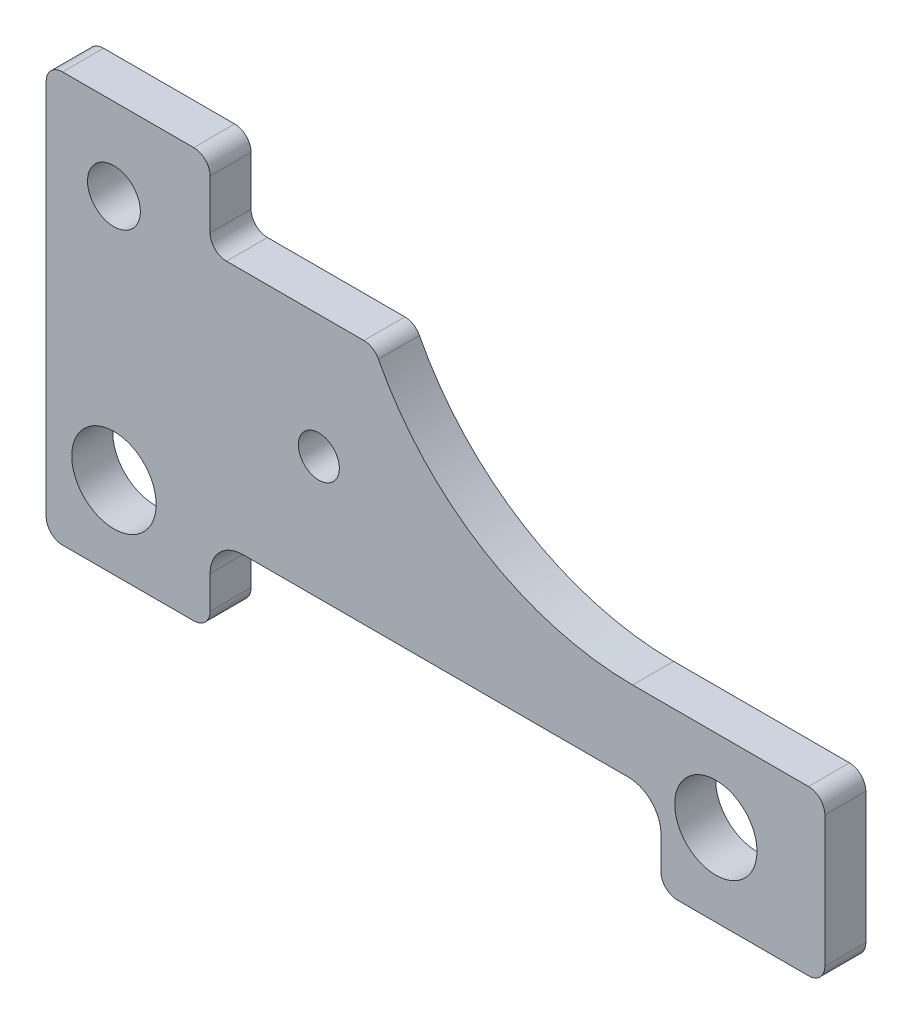
ISO-10303-21;
HEADER;
FILE_DESCRIPTION(('STEP AP214'),'2;1');
FILE_NAME('part.step','',(''),(''),'','','');
FILE_SCHEMA(('AUTOMOTIVE_DESIGN { 1 0 10303 214 1 1 1 1 }'));
ENDSEC;
DATA;
#1=APPLICATION_CONTEXT('core data for automotive mechanical design processes');
#2=APPLICATION_PROTOCOL_DEFINITION('international standard','automotive_design',2000,#1);
#3=PRODUCT_CONTEXT('',#1,'mechanical');
#4=PRODUCT('Part','Part','',(#3));
#5=PRODUCT_RELATED_PRODUCT_CATEGORY('part','',(#4));
#6=PRODUCT_DEFINITION_FORMATION('','',#4);
#7=PRODUCT_DEFINITION_CONTEXT('part definition',#1,'design');
#8=PRODUCT_DEFINITION('design','',#6,#7);
#9=PRODUCT_DEFINITION_SHAPE('','',#8);
#10=(LENGTH_UNIT() NAMED_UNIT(*) SI_UNIT(.MILLI.,.METRE.));
#11=(NAMED_UNIT(*) PLANE_ANGLE_UNIT() SI_UNIT($,.RADIAN.));
#12=(NAMED_UNIT(*) SI_UNIT($,.STERADIAN.) SOLID_ANGLE_UNIT());
#13=UNCERTAINTY_MEASURE_WITH_UNIT(LENGTH_MEASURE(1.E-05),#10,'distance_accuracy_value','');
#14=(GEOMETRIC_REPRESENTATION_CONTEXT(3) GLOBAL_UNCERTAINTY_ASSIGNED_CONTEXT((#13)) GLOBAL_UNIT_ASSIGNED_CONTEXT((#10,
#11,#12)) REPRESENTATION_CONTEXT('',''));
#15=CARTESIAN_POINT('',(0.,0.,0.));
#16=DIRECTION('',(0.,0.,1.));
#17=DIRECTION('',(1.,0.,0.));
#18=AXIS2_PLACEMENT_3D('',#15,#16,#17);
#19=CARTESIAN_POINT('',(35.2424242424242,-19.,5.));
#20=DIRECTION('',(0.,0.,-1.));
#21=DIRECTION('',(-1.,0.,0.));
#22=AXIS2_PLACEMENT_3D('',#19,#20,#21);
#23=PLANE('',#22);
#24=DIRECTION('',(1.,0.,0.));
#25=VECTOR('',#24,1.);
#26=CARTESIAN_POINT('',(-11.7575757575757,-15.,5.));
#27=LINE('',#26,#25);
#28=CARTESIAN_POINT('',(-11.7575757575757,-15.,5.));
#29=VERTEX_POINT('',#28);
#30=CARTESIAN_POINT('',(35.2424242424242,-15.,5.));
#31=VERTEX_POINT('',#30);
#32=EDGE_CURVE('E141',#29,#31,#27,.T.);
#33=ORIENTED_EDGE('',*,*,#32,.T.);
#34=CARTESIAN_POINT('',(35.2424242424242,-19.,5.));
#35=DIRECTION('',(0.,0.,-1.));
#36=DIRECTION('',(-1.,0.,0.));
#37=AXIS2_PLACEMENT_3D('',#34,#35,#36);
#38=CIRCLE('',#37,4.);
#39=CARTESIAN_POINT('',(39.2424242424242,-19.,5.));
#40=VERTEX_POINT('',#39);
#41=EDGE_CURVE('E392',#31,#40,#38,.T.);
#42=ORIENTED_EDGE('',*,*,#41,.T.);
#43=DIRECTION('',(0.,-1.,0.));
#44=VECTOR('',#43,1.);
#45=CARTESIAN_POINT('',(39.2424242424242,-19.,5.));
#46=LINE('',#45,#44);
#47=CARTESIAN_POINT('',(39.2424242424242,-23.,5.));
#48=VERTEX_POINT('',#47);
#49=EDGE_CURVE('E329',#40,#48,#46,.T.);
#50=ORIENTED_EDGE('',*,*,#49,.T.);
#51=CARTESIAN_POINT('',(41.2424242424242,-23.,5.));
#52=DIRECTION('',(0.,0.,1.));
#53=DIRECTION('',(-1.,0.,0.));
#54=AXIS2_PLACEMENT_3D('',#51,#52,#53);
#55=CIRCLE('',#54,2.);
#56=CARTESIAN_POINT('',(41.2424242424242,-25.,5.));
#57=VERTEX_POINT('',#56);
#58=EDGE_CURVE('E348',#48,#57,#55,.T.);
#59=ORIENTED_EDGE('',*,*,#58,.T.);
#60=DIRECTION('',(1.,0.,0.));
#61=VECTOR('',#60,1.);
#62=CARTESIAN_POINT('',(41.2424242424242,-25.,5.));
#63=LINE('',#62,#61);
#64=CARTESIAN_POINT('',(57.2424242424242,-25.,5.));
#65=VERTEX_POINT('',#64);
#66=EDGE_CURVE('E345',#57,#65,#63,.T.);
#67=ORIENTED_EDGE('',*,*,#66,.T.);
#68=CARTESIAN_POINT('',(57.2424242424242,-23.,5.));
#69=DIRECTION('',(0.,0.,1.));
#70=DIRECTION('',(1.,0.,0.));
#71=AXIS2_PLACEMENT_3D('',#68,#69,#70);
#72=CIRCLE('',#71,2.);
#73=CARTESIAN_POINT('',(59.2424242424242,-23.,5.));
#74=VERTEX_POINT('',#73);
#75=EDGE_CURVE('E347',#65,#74,#72,.T.);
#76=ORIENTED_EDGE('',*,*,#75,.T.);
#77=DIRECTION('',(0.,1.,0.));
#78=VECTOR('',#77,1.);
#79=CARTESIAN_POINT('',(59.2424242424242,-23.,5.));
#80=LINE('',#79,#78);
#81=CARTESIAN_POINT('',(59.2424242424242,-7.00000000000002,5.));
#82=VERTEX_POINT('',#81);
#83=EDGE_CURVE('E350',#74,#82,#80,.T.);
#84=ORIENTED_EDGE('',*,*,#83,.T.);
#85=CARTESIAN_POINT('',(57.2424242424242,-7.,5.));
#86=DIRECTION('',(0.,0.,1.));
#87=DIRECTION('',(-1.,0.,0.));
#88=AXIS2_PLACEMENT_3D('',#85,#86,#87);
#89=CIRCLE('',#88,2.);
#90=CARTESIAN_POINT('',(57.2424242424242,-5.,5.));
#91=VERTEX_POINT('',#90);
#92=EDGE_CURVE('E356',#82,#91,#89,.T.);
#93=ORIENTED_EDGE('',*,*,#92,.T.);
#94=DIRECTION('',(-1.,0.,0.));
#95=VECTOR('',#94,1.);
#96=CARTESIAN_POINT('',(57.2424242424242,-5.,5.));
#97=LINE('',#96,#95);
#98=CARTESIAN_POINT('',(35.792732381733,-5.,5.));
#99=VERTEX_POINT('',#98);
#100=EDGE_CURVE('E358',#91,#99,#97,.T.);
#101=ORIENTED_EDGE('',*,*,#100,.T.);
#102=CARTESIAN_POINT('',(35.8652364660258,29.9999249021732,5.));
#103=DIRECTION('',(0.,0.,-1.));
#104=DIRECTION('',(1.,0.,0.));
#105=AXIS2_PLACEMENT_3D('',#102,#103,#104);
#106=CIRCLE('',#105,35.);
#107=CARTESIAN_POINT('',(4.77824375187092,13.9189148595769,5.));
#108=VERTEX_POINT('',#107);
#109=EDGE_CURVE('E360',#99,#108,#106,.T.);
#110=ORIENTED_EDGE('',*,*,#109,.T.);
#111=CARTESIAN_POINT('',(3.00184416820493,13.,5.));
#112=DIRECTION('',(0.,0.,1.));
#113=DIRECTION('',(1.,0.,0.));
#114=AXIS2_PLACEMENT_3D('',#111,#112,#113);
#115=CIRCLE('',#114,2.);
#116=CARTESIAN_POINT('',(3.00184416820493,15.,5.));
#117=VERTEX_POINT('',#116);
#118=EDGE_CURVE('E362',#108,#117,#115,.T.);
#119=ORIENTED_EDGE('',*,*,#118,.T.);
#120=DIRECTION('',(-1.,0.,0.));
#121=VECTOR('',#120,1.);
#122=CARTESIAN_POINT('',(-13.7575757575757,15.,5.));
#123=LINE('',#122,#121);
#124=CARTESIAN_POINT('',(-13.7575757575757,15.,5.));
#125=VERTEX_POINT('',#124);
#126=EDGE_CURVE('E364',#117,#125,#123,.T.);
#127=ORIENTED_EDGE('',*,*,#126,.T.);
#128=CARTESIAN_POINT('',(-13.7575757575758,17.,5.));
#129=DIRECTION('',(0.,0.,-1.));
#130=DIRECTION('',(1.,0.,0.));
#131=AXIS2_PLACEMENT_3D('',#128,#129,#130);
#132=CIRCLE('',#131,2.);
#133=CARTESIAN_POINT('',(-15.7575757575758,17.,5.));
#134=VERTEX_POINT('',#133);
#135=EDGE_CURVE('E366',#125,#134,#132,.T.);
#136=ORIENTED_EDGE('',*,*,#135,.T.);
#137=DIRECTION('',(0.,1.,0.));
#138=VECTOR('',#137,1.);
#139=CARTESIAN_POINT('',(-15.7575757575758,23.,5.));
#140=LINE('',#139,#138);
#141=CARTESIAN_POINT('',(-15.7575757575758,23.,5.));
#142=VERTEX_POINT('',#141);
#143=EDGE_CURVE('E368',#134,#142,#140,.T.);
#144=ORIENTED_EDGE('',*,*,#143,.T.);
#145=CARTESIAN_POINT('',(-17.7575757575758,23.,5.));
#146=DIRECTION('',(0.,0.,1.));
#147=DIRECTION('',(-1.,0.,0.));
#148=AXIS2_PLACEMENT_3D('',#145,#146,#147);
#149=CIRCLE('',#148,2.);
#150=CARTESIAN_POINT('',(-17.7575757575758,25.,5.));
#151=VERTEX_POINT('',#150);
#152=EDGE_CURVE('E370',#142,#151,#149,.T.);
#153=ORIENTED_EDGE('',*,*,#152,.T.);
#154=DIRECTION('',(-1.,0.,0.));
#155=VECTOR('',#154,1.);
#156=CARTESIAN_POINT('',(-33.7575757575758,25.,5.));
#157=LINE('',#156,#155);
#158=CARTESIAN_POINT('',(-33.7575757575758,25.,5.));
#159=VERTEX_POINT('',#158);
#160=EDGE_CURVE('E372',#151,#159,#157,.T.);
#161=ORIENTED_EDGE('',*,*,#160,.T.);
#162=CARTESIAN_POINT('',(-33.7575757575758,23.,5.));
#163=DIRECTION('',(0.,0.,1.));
#164=DIRECTION('',(-1.,0.,0.));
#165=AXIS2_PLACEMENT_3D('',#162,#163,#164);
#166=CIRCLE('',#165,2.);
#167=CARTESIAN_POINT('',(-35.7575757575758,23.,5.));
#168=VERTEX_POINT('',#167);
#169=EDGE_CURVE('E374',#159,#168,#166,.T.);
#170=ORIENTED_EDGE('',*,*,#169,.T.);
#171=DIRECTION('',(0.,-1.,0.));
#172=VECTOR('',#171,1.);
#173=CARTESIAN_POINT('',(-35.7575757575758,23.,5.));
#174=LINE('',#173,#172);
#175=CARTESIAN_POINT('',(-35.7575757575758,-23.,5.));
#176=VERTEX_POINT('',#175);
#177=EDGE_CURVE('E376',#168,#176,#174,.T.);
#178=ORIENTED_EDGE('',*,*,#177,.T.);
#179=CARTESIAN_POINT('',(-33.7575757575758,-23.,5.));
#180=DIRECTION('',(0.,0.,1.));
#181=DIRECTION('',(-1.,0.,0.));
#182=AXIS2_PLACEMENT_3D('',#179,#180,#181);
#183=CIRCLE('',#182,2.);
#184=CARTESIAN_POINT('',(-33.7575757575757,-25.,5.));
#185=VERTEX_POINT('',#184);
#186=EDGE_CURVE('E378',#176,#185,#183,.T.);
#187=ORIENTED_EDGE('',*,*,#186,.T.);
#188=DIRECTION('',(1.,0.,0.));
#189=VECTOR('',#188,1.);
#190=CARTESIAN_POINT('',(-33.7575757575757,-25.,5.));
#191=LINE('',#190,#189);
#192=CARTESIAN_POINT('',(-17.7575757575758,-25.,5.));
#193=VERTEX_POINT('',#192);
#194=EDGE_CURVE('E206',#185,#193,#191,.T.);
#195=ORIENTED_EDGE('',*,*,#194,.T.);
#196=CARTESIAN_POINT('',(-17.7575757575758,-23.,5.));
#197=DIRECTION('',(0.,0.,1.));
#198=DIRECTION('',(1.,0.,0.));
#199=AXIS2_PLACEMENT_3D('',#196,#197,#198);
#200=CIRCLE('',#199,2.);
#201=CARTESIAN_POINT('',(-15.7575757575758,-23.,5.));
#202=VERTEX_POINT('',#201);
#203=EDGE_CURVE('E200',#193,#202,#200,.T.);
#204=ORIENTED_EDGE('',*,*,#203,.T.);
#205=DIRECTION('',(0.,1.,0.));
#206=VECTOR('',#205,1.);
#207=CARTESIAN_POINT('',(-15.7575757575758,-19.,5.));
#208=LINE('',#207,#206);
#209=CARTESIAN_POINT('',(-15.7575757575758,-19.,5.));
#210=VERTEX_POINT('',#209);
#211=EDGE_CURVE('E204',#202,#210,#208,.T.);
#212=ORIENTED_EDGE('',*,*,#211,.T.);
#213=CARTESIAN_POINT('',(-11.7575757575758,-19.,5.));
#214=DIRECTION('',(0.,0.,-1.));
#215=DIRECTION('',(-1.,0.,0.));
#216=AXIS2_PLACEMENT_3D('',#213,#214,#215);
#217=CIRCLE('',#216,4.);
#218=EDGE_CURVE('E54',#210,#29,#217,.T.);
#219=ORIENTED_EDGE('',*,*,#218,.T.);
#220=EDGE_LOOP('',(#33,#42,#50,#59,#67,#76,#84,#93,#101,#110,#119,#127,#136,#144,#153,#161,#170,
#178,#187,#195,#204,#212,#219));
#221=FACE_BOUND('',#220,.T.);
#222=CARTESIAN_POINT('',(45.9440771313276,-15.,5.));
#223=DIRECTION('',(0.,0.,1.));
#224=DIRECTION('',(1.,0.,0.));
#225=AXIS2_PLACEMENT_3D('',#222,#223,#224);
#226=CIRCLE('',#225,5.01807771651485);
#227=CARTESIAN_POINT('',(50.9621548478424,-15.,5.));
#228=VERTEX_POINT('',#227);
#229=EDGE_CURVE('E226',#228,#228,#226,.T.);
#230=ORIENTED_EDGE('',*,*,#229,.F.);
#231=EDGE_LOOP('',(#230));
#232=FACE_BOUND('',#231,.T.);
#233=CARTESIAN_POINT('',(-27.4902663030158,-15.,5.));
#234=DIRECTION('',(0.,0.,1.));
#235=DIRECTION('',(1.,0.,0.));
#236=AXIS2_PLACEMENT_3D('',#233,#234,#235);
#237=CIRCLE('',#236,5.15);
#238=CARTESIAN_POINT('',(-22.3402663030158,-15.,5.));
#239=VERTEX_POINT('',#238);
#240=EDGE_CURVE('E743',#239,#239,#237,.T.);
#241=ORIENTED_EDGE('',*,*,#240,.F.);
#242=EDGE_LOOP('',(#241));
#243=FACE_BOUND('',#242,.T.);
#244=CARTESIAN_POINT('',(-27.4902663030159,15.,5.));
#245=DIRECTION('',(0.,0.,1.));
#246=DIRECTION('',(1.,0.,0.));
#247=AXIS2_PLACEMENT_3D('',#244,#245,#246);
#248=CIRCLE('',#247,3.225);
#249=CARTESIAN_POINT('',(-24.2652663030159,15.,5.));
#250=VERTEX_POINT('',#249);
#251=EDGE_CURVE('E737',#250,#250,#248,.T.);
#252=ORIENTED_EDGE('',*,*,#251,.F.);
#253=EDGE_LOOP('',(#252));
#254=FACE_BOUND('',#253,.T.);
#255=CARTESIAN_POINT('',(-2.49026630301585,0.,5.));
#256=DIRECTION('',(0.,0.,1.));
#257=DIRECTION('',(1.,0.,0.));
#258=AXIS2_PLACEMENT_3D('',#255,#256,#257);
#259=CIRCLE('',#258,2.5);
#260=CARTESIAN_POINT('',(0.00973369698414666,0.,5.));
#261=VERTEX_POINT('',#260);
#262=EDGE_CURVE('E728',#261,#261,#259,.T.);
#263=ORIENTED_EDGE('',*,*,#262,.F.);
#264=EDGE_LOOP('',(#263));
#265=FACE_BOUND('',#264,.T.);
#266=ADVANCED_FACE('F37',(#221,#232,#243,#254,#265),#23,.F.);
#267=CARTESIAN_POINT('',(35.2424242424242,-19.,0.));
#268=DIRECTION('',(0.,0.,-1.));
#269=DIRECTION('',(-1.,0.,0.));
#270=AXIS2_PLACEMENT_3D('',#267,#268,#269);
#271=PLANE('',#270);
#272=CARTESIAN_POINT('',(-27.4902663030159,15.,0.));
#273=DIRECTION('',(0.,0.,1.));
#274=DIRECTION('',(1.,0.,0.));
#275=AXIS2_PLACEMENT_3D('',#272,#273,#274);
#276=CIRCLE('',#275,3.225);
#277=CARTESIAN_POINT('',(-24.2652663030159,15.,0.));
#278=VERTEX_POINT('',#277);
#279=EDGE_CURVE('E734',#278,#278,#276,.T.);
#280=ORIENTED_EDGE('',*,*,#279,.T.);
#281=EDGE_LOOP('',(#280));
#282=FACE_BOUND('',#281,.T.);
#283=CARTESIAN_POINT('',(45.9440771313276,-15.,0.));
#284=DIRECTION('',(0.,0.,1.));
#285=DIRECTION('',(1.,0.,0.));
#286=AXIS2_PLACEMENT_3D('',#283,#284,#285);
#287=CIRCLE('',#286,5.01807771651485);
#288=CARTESIAN_POINT('',(50.9621548478424,-15.,0.));
#289=VERTEX_POINT('',#288);
#290=EDGE_CURVE('E396',#289,#289,#287,.T.);
#291=ORIENTED_EDGE('',*,*,#290,.T.);
#292=EDGE_LOOP('',(#291));
#293=FACE_BOUND('',#292,.T.);
#294=DIRECTION('',(1.,0.,0.));
#295=VECTOR('',#294,1.);
#296=CARTESIAN_POINT('',(4.24242424242424,-15.,0.));
#297=LINE('',#296,#295);
#298=CARTESIAN_POINT('',(-11.7575757575757,-15.,0.));
#299=VERTEX_POINT('',#298);
#300=CARTESIAN_POINT('',(35.2424242424242,-15.,0.));
#301=VERTEX_POINT('',#300);
#302=EDGE_CURVE('E135',#299,#301,#297,.T.);
#303=ORIENTED_EDGE('',*,*,#302,.F.);
#304=CARTESIAN_POINT('',(-11.7575757575758,-19.,0.));
#305=DIRECTION('',(0.,0.,-1.));
#306=DIRECTION('',(-1.,0.,0.));
#307=AXIS2_PLACEMENT_3D('',#304,#305,#306);
#308=CIRCLE('',#307,4.);
#309=CARTESIAN_POINT('',(-15.7575757575758,-19.,0.));
#310=VERTEX_POINT('',#309);
#311=EDGE_CURVE('E266',#310,#299,#308,.T.);
#312=ORIENTED_EDGE('',*,*,#311,.F.);
#313=DIRECTION('',(0.,1.,0.));
#314=VECTOR('',#313,1.);
#315=CARTESIAN_POINT('',(-15.7575757575758,-19.,0.));
#316=LINE('',#315,#314);
#317=CARTESIAN_POINT('',(-15.7575757575758,-23.,0.));
#318=VERTEX_POINT('',#317);
#319=EDGE_CURVE('E128',#318,#310,#316,.T.);
#320=ORIENTED_EDGE('',*,*,#319,.F.);
#321=CARTESIAN_POINT('',(-17.7575757575758,-23.,0.));
#322=DIRECTION('',(0.,0.,1.));
#323=DIRECTION('',(1.,0.,0.));
#324=AXIS2_PLACEMENT_3D('',#321,#322,#323);
#325=CIRCLE('',#324,2.);
#326=CARTESIAN_POINT('',(-17.7575757575758,-25.,0.));
#327=VERTEX_POINT('',#326);
#328=EDGE_CURVE('E214',#327,#318,#325,.T.);
#329=ORIENTED_EDGE('',*,*,#328,.F.);
#330=DIRECTION('',(1.,0.,0.));
#331=VECTOR('',#330,1.);
#332=CARTESIAN_POINT('',(-33.7575757575757,-25.,0.));
#333=LINE('',#332,#331);
#334=CARTESIAN_POINT('',(-33.7575757575757,-25.,0.));
#335=VERTEX_POINT('',#334);
#336=EDGE_CURVE('E262',#335,#327,#333,.T.);
#337=ORIENTED_EDGE('',*,*,#336,.F.);
#338=CARTESIAN_POINT('',(-33.7575757575758,-23.,0.));
#339=DIRECTION('',(0.,0.,1.));
#340=DIRECTION('',(-1.,0.,0.));
#341=AXIS2_PLACEMENT_3D('',#338,#339,#340);
#342=CIRCLE('',#341,2.);
#343=CARTESIAN_POINT('',(-35.7575757575758,-23.,0.));
#344=VERTEX_POINT('',#343);
#345=EDGE_CURVE('E260',#344,#335,#342,.T.);
#346=ORIENTED_EDGE('',*,*,#345,.F.);
#347=DIRECTION('',(0.,-1.,0.));
#348=VECTOR('',#347,1.);
#349=CARTESIAN_POINT('',(-35.7575757575758,23.,0.));
#350=LINE('',#349,#348);
#351=CARTESIAN_POINT('',(-35.7575757575758,23.,0.));
#352=VERTEX_POINT('',#351);
#353=EDGE_CURVE('E258',#352,#344,#350,.T.);
#354=ORIENTED_EDGE('',*,*,#353,.F.);
#355=CARTESIAN_POINT('',(-33.7575757575758,23.,0.));
#356=DIRECTION('',(0.,0.,1.));
#357=DIRECTION('',(-1.,0.,0.));
#358=AXIS2_PLACEMENT_3D('',#355,#356,#357);
#359=CIRCLE('',#358,2.);
#360=CARTESIAN_POINT('',(-33.7575757575758,25.,0.));
#361=VERTEX_POINT('',#360);
#362=EDGE_CURVE('E256',#361,#352,#359,.T.);
#363=ORIENTED_EDGE('',*,*,#362,.F.);
#364=DIRECTION('',(-1.,0.,0.));
#365=VECTOR('',#364,1.);
#366=CARTESIAN_POINT('',(-33.7575757575758,25.,0.));
#367=LINE('',#366,#365);
#368=CARTESIAN_POINT('',(-17.7575757575758,25.,0.));
#369=VERTEX_POINT('',#368);
#370=EDGE_CURVE('E254',#369,#361,#367,.T.);
#371=ORIENTED_EDGE('',*,*,#370,.F.);
#372=CARTESIAN_POINT('',(-17.7575757575758,23.,0.));
#373=DIRECTION('',(0.,0.,1.));
#374=DIRECTION('',(-1.,0.,0.));
#375=AXIS2_PLACEMENT_3D('',#372,#373,#374);
#376=CIRCLE('',#375,2.);
#377=CARTESIAN_POINT('',(-15.7575757575758,23.,0.));
#378=VERTEX_POINT('',#377);
#379=EDGE_CURVE('E252',#378,#369,#376,.T.);
#380=ORIENTED_EDGE('',*,*,#379,.F.);
#381=DIRECTION('',(0.,1.,0.));
#382=VECTOR('',#381,1.);
#383=CARTESIAN_POINT('',(-15.7575757575758,23.,0.));
#384=LINE('',#383,#382);
#385=CARTESIAN_POINT('',(-15.7575757575758,17.,0.));
#386=VERTEX_POINT('',#385);
#387=EDGE_CURVE('E250',#386,#378,#384,.T.);
#388=ORIENTED_EDGE('',*,*,#387,.F.);
#389=CARTESIAN_POINT('',(-13.7575757575758,17.,0.));
#390=DIRECTION('',(0.,0.,-1.));
#391=DIRECTION('',(1.,0.,0.));
#392=AXIS2_PLACEMENT_3D('',#389,#390,#391);
#393=CIRCLE('',#392,2.);
#394=CARTESIAN_POINT('',(-13.7575757575757,15.,0.));
#395=VERTEX_POINT('',#394);
#396=EDGE_CURVE('E248',#395,#386,#393,.T.);
#397=ORIENTED_EDGE('',*,*,#396,.F.);
#398=DIRECTION('',(-1.,0.,0.));
#399=VECTOR('',#398,1.);
#400=CARTESIAN_POINT('',(-13.7575757575757,15.,0.));
#401=LINE('',#400,#399);
#402=CARTESIAN_POINT('',(3.00184416820493,15.,0.));
#403=VERTEX_POINT('',#402);
#404=EDGE_CURVE('E246',#403,#395,#401,.T.);
#405=ORIENTED_EDGE('',*,*,#404,.F.);
#406=CARTESIAN_POINT('',(3.00184416820493,13.,0.));
#407=DIRECTION('',(0.,0.,1.));
#408=DIRECTION('',(1.,0.,0.));
#409=AXIS2_PLACEMENT_3D('',#406,#407,#408);
#410=CIRCLE('',#409,2.);
#411=CARTESIAN_POINT('',(4.77824375187092,13.9189148595769,0.));
#412=VERTEX_POINT('',#411);
#413=EDGE_CURVE('E244',#412,#403,#410,.T.);
#414=ORIENTED_EDGE('',*,*,#413,.F.);
#415=CARTESIAN_POINT('',(35.8652364660258,29.9999249021732,0.));
#416=DIRECTION('',(0.,0.,-1.));
#417=DIRECTION('',(1.,0.,0.));
#418=AXIS2_PLACEMENT_3D('',#415,#416,#417);
#419=CIRCLE('',#418,35.);
#420=CARTESIAN_POINT('',(35.792732381733,-5.,0.));
#421=VERTEX_POINT('',#420);
#422=EDGE_CURVE('E242',#421,#412,#419,.T.);
#423=ORIENTED_EDGE('',*,*,#422,.F.);
#424=DIRECTION('',(-1.,0.,0.));
#425=VECTOR('',#424,1.);
#426=CARTESIAN_POINT('',(57.2424242424242,-5.,0.));
#427=LINE('',#426,#425);
#428=CARTESIAN_POINT('',(57.2424242424242,-5.,0.));
#429=VERTEX_POINT('',#428);
#430=EDGE_CURVE('E240',#429,#421,#427,.T.);
#431=ORIENTED_EDGE('',*,*,#430,.F.);
#432=CARTESIAN_POINT('',(57.2424242424242,-7.,0.));
#433=DIRECTION('',(0.,0.,1.));
#434=DIRECTION('',(-1.,0.,0.));
#435=AXIS2_PLACEMENT_3D('',#432,#433,#434);
#436=CIRCLE('',#435,2.);
#437=CARTESIAN_POINT('',(59.2424242424242,-7.00000000000002,0.));
#438=VERTEX_POINT('',#437);
#439=EDGE_CURVE('E238',#438,#429,#436,.T.);
#440=ORIENTED_EDGE('',*,*,#439,.F.);
#441=DIRECTION('',(0.,1.,0.));
#442=VECTOR('',#441,1.);
#443=CARTESIAN_POINT('',(59.2424242424242,-23.,0.));
#444=LINE('',#443,#442);
#445=CARTESIAN_POINT('',(59.2424242424242,-23.,0.));
#446=VERTEX_POINT('',#445);
#447=EDGE_CURVE('E236',#446,#438,#444,.T.);
#448=ORIENTED_EDGE('',*,*,#447,.F.);
#449=CARTESIAN_POINT('',(57.2424242424242,-23.,0.));
#450=DIRECTION('',(0.,0.,1.));
#451=DIRECTION('',(1.,0.,0.));
#452=AXIS2_PLACEMENT_3D('',#449,#450,#451);
#453=CIRCLE('',#452,2.);
#454=CARTESIAN_POINT('',(57.2424242424242,-25.,0.));
#455=VERTEX_POINT('',#454);
#456=EDGE_CURVE('E234',#455,#446,#453,.T.);
#457=ORIENTED_EDGE('',*,*,#456,.F.);
#458=DIRECTION('',(1.,0.,0.));
#459=VECTOR('',#458,1.);
#460=CARTESIAN_POINT('',(41.2424242424242,-25.,0.));
#461=LINE('',#460,#459);
#462=CARTESIAN_POINT('',(41.2424242424242,-25.,0.));
#463=VERTEX_POINT('',#462);
#464=EDGE_CURVE('E232',#463,#455,#461,.T.);
#465=ORIENTED_EDGE('',*,*,#464,.F.);
#466=CARTESIAN_POINT('',(41.2424242424242,-23.,0.));
#467=DIRECTION('',(0.,0.,1.));
#468=DIRECTION('',(-1.,0.,0.));
#469=AXIS2_PLACEMENT_3D('',#466,#467,#468);
#470=CIRCLE('',#469,2.);
#471=CARTESIAN_POINT('',(39.2424242424242,-23.,0.));
#472=VERTEX_POINT('',#471);
#473=EDGE_CURVE('E230',#472,#463,#470,.T.);
#474=ORIENTED_EDGE('',*,*,#473,.F.);
#475=DIRECTION('',(0.,-1.,0.));
#476=VECTOR('',#475,1.);
#477=CARTESIAN_POINT('',(39.2424242424242,-19.,0.));
#478=LINE('',#477,#476);
#479=CARTESIAN_POINT('',(39.2424242424242,-19.,0.));
#480=VERTEX_POINT('',#479);
#481=EDGE_CURVE('E228',#480,#472,#478,.T.);
#482=ORIENTED_EDGE('',*,*,#481,.F.);
#483=CARTESIAN_POINT('',(35.2424242424242,-19.,0.));
#484=DIRECTION('',(0.,0.,-1.));
#485=DIRECTION('',(-1.,0.,0.));
#486=AXIS2_PLACEMENT_3D('',#483,#484,#485);
#487=CIRCLE('',#486,4.);
#488=EDGE_CURVE('E225',#301,#480,#487,.T.);
#489=ORIENTED_EDGE('',*,*,#488,.F.);
#490=EDGE_LOOP('',(#303,#312,#320,#329,#337,#346,#354,#363,#371,#380,#388,#397,#405,#414,#423,
#431,#440,#448,#457,#465,#474,#482,#489));
#491=FACE_BOUND('',#490,.T.);
#492=CARTESIAN_POINT('',(-27.4902663030158,-15.,0.));
#493=DIRECTION('',(0.,0.,1.));
#494=DIRECTION('',(1.,0.,0.));
#495=AXIS2_PLACEMENT_3D('',#492,#493,#494);
#496=CIRCLE('',#495,5.15);
#497=CARTESIAN_POINT('',(-22.3402663030158,-15.,0.));
#498=VERTEX_POINT('',#497);
#499=EDGE_CURVE('E740',#498,#498,#496,.T.);
#500=ORIENTED_EDGE('',*,*,#499,.T.);
#501=EDGE_LOOP('',(#500));
#502=FACE_BOUND('',#501,.T.);
#503=CARTESIAN_POINT('',(-2.49026630301585,0.,0.));
#504=DIRECTION('',(0.,0.,1.));
#505=DIRECTION('',(1.,0.,0.));
#506=AXIS2_PLACEMENT_3D('',#503,#504,#505);
#507=CIRCLE('',#506,2.5);
#508=CARTESIAN_POINT('',(0.00973369698414666,0.,0.));
#509=VERTEX_POINT('',#508);
#510=EDGE_CURVE('E731',#509,#509,#507,.T.);
#511=ORIENTED_EDGE('',*,*,#510,.T.);
#512=EDGE_LOOP('',(#511));
#513=FACE_BOUND('',#512,.T.);
#514=ADVANCED_FACE('F333',(#282,#293,#491,#502,#513),#271,.T.);
#515=CARTESIAN_POINT('',(4.24242424242424,-15.,5.));
#516=DIRECTION('',(0.,1.,0.));
#517=DIRECTION('',(0.,0.,1.));
#518=AXIS2_PLACEMENT_3D('',#515,#516,#517);
#519=PLANE('',#518);
#520=ORIENTED_EDGE('',*,*,#302,.T.);
#521=DIRECTION('',(0.,0.,-1.));
#522=VECTOR('',#521,1.);
#523=CARTESIAN_POINT('',(35.2424242424242,-15.,5.));
#524=LINE('',#523,#522);
#525=EDGE_CURVE('E11',#31,#301,#524,.T.);
#526=ORIENTED_EDGE('',*,*,#525,.F.);
#527=ORIENTED_EDGE('',*,*,#32,.F.);
#528=DIRECTION('',(0.,0.,-1.));
#529=VECTOR('',#528,1.);
#530=CARTESIAN_POINT('',(-11.7575757575757,-15.,5.));
#531=LINE('',#530,#529);
#532=EDGE_CURVE('E220',#29,#299,#531,.T.);
#533=ORIENTED_EDGE('',*,*,#532,.T.);
#534=EDGE_LOOP('',(#520,#526,#527,#533));
#535=FACE_BOUND('',#534,.T.);
#536=ADVANCED_FACE('F39',(#535),#519,.F.);
#537=CARTESIAN_POINT('',(35.2424242424242,-19.,5.));
#538=DIRECTION('',(0.,0.,-1.));
#539=DIRECTION('',(-1.,0.,0.));
#540=AXIS2_PLACEMENT_3D('',#537,#538,#539);
#541=CYLINDRICAL_SURFACE('',#540,4.);
#542=ORIENTED_EDGE('',*,*,#488,.T.);
#543=DIRECTION('',(0.,0.,-1.));
#544=VECTOR('',#543,1.);
#545=CARTESIAN_POINT('',(39.2424242424242,-19.,5.));
#546=LINE('',#545,#544);
#547=EDGE_CURVE('E46',#40,#480,#546,.T.);
#548=ORIENTED_EDGE('',*,*,#547,.F.);
#549=ORIENTED_EDGE('',*,*,#41,.F.);
#550=ORIENTED_EDGE('',*,*,#525,.T.);
#551=EDGE_LOOP('',(#542,#548,#549,#550));
#552=FACE_BOUND('',#551,.T.);
#553=ADVANCED_FACE('F398',(#552),#541,.F.);
#554=CARTESIAN_POINT('',(39.2424242424242,-19.,5.));
#555=DIRECTION('',(1.,0.,0.));
#556=DIRECTION('',(0.,1.,0.));
#557=AXIS2_PLACEMENT_3D('',#554,#555,#556);
#558=PLANE('',#557);
#559=ORIENTED_EDGE('',*,*,#481,.T.);
#560=DIRECTION('',(0.,0.,-1.));
#561=VECTOR('',#560,1.);
#562=CARTESIAN_POINT('',(39.2424242424242,-23.,5.));
#563=LINE('',#562,#561);
#564=EDGE_CURVE('E320',#48,#472,#563,.T.);
#565=ORIENTED_EDGE('',*,*,#564,.F.);
#566=ORIENTED_EDGE('',*,*,#49,.F.);
#567=ORIENTED_EDGE('',*,*,#547,.T.);
#568=EDGE_LOOP('',(#559,#565,#566,#567));
#569=FACE_BOUND('',#568,.T.);
#570=ADVANCED_FACE('F327',(#569),#558,.F.);
#571=CARTESIAN_POINT('',(41.2424242424242,-23.,5.));
#572=DIRECTION('',(0.,0.,-1.));
#573=DIRECTION('',(-1.,0.,0.));
#574=AXIS2_PLACEMENT_3D('',#571,#572,#573);
#575=CYLINDRICAL_SURFACE('',#574,2.);
#576=ORIENTED_EDGE('',*,*,#473,.T.);
#577=DIRECTION('',(0.,0.,-1.));
#578=VECTOR('',#577,1.);
#579=CARTESIAN_POINT('',(41.2424242424242,-25.,5.));
#580=LINE('',#579,#578);
#581=EDGE_CURVE('E317',#57,#463,#580,.T.);
#582=ORIENTED_EDGE('',*,*,#581,.F.);
#583=ORIENTED_EDGE('',*,*,#58,.F.);
#584=ORIENTED_EDGE('',*,*,#564,.T.);
#585=EDGE_LOOP('',(#576,#582,#583,#584));
#586=FACE_BOUND('',#585,.T.);
#587=ADVANCED_FACE('F339',(#586),#575,.T.);
#588=CARTESIAN_POINT('',(41.2424242424242,-25.,5.));
#589=DIRECTION('',(0.,1.,0.));
#590=DIRECTION('',(0.,0.,1.));
#591=AXIS2_PLACEMENT_3D('',#588,#589,#590);
#592=PLANE('',#591);
#593=ORIENTED_EDGE('',*,*,#464,.T.);
#594=DIRECTION('',(0.,0.,-1.));
#595=VECTOR('',#594,1.);
#596=CARTESIAN_POINT('',(57.2424242424242,-25.,5.));
#597=LINE('',#596,#595);
#598=EDGE_CURVE('E314',#65,#455,#597,.T.);
#599=ORIENTED_EDGE('',*,*,#598,.F.);
#600=ORIENTED_EDGE('',*,*,#66,.F.);
#601=ORIENTED_EDGE('',*,*,#581,.T.);
#602=EDGE_LOOP('',(#593,#599,#600,#601));
#603=FACE_BOUND('',#602,.T.);
#604=ADVANCED_FACE('F343',(#603),#592,.F.);
#605=CARTESIAN_POINT('',(57.2424242424242,-23.,5.));
#606=DIRECTION('',(0.,0.,-1.));
#607=DIRECTION('',(-1.,0.,0.));
#608=AXIS2_PLACEMENT_3D('',#605,#606,#607);
#609=CYLINDRICAL_SURFACE('',#608,2.);
#610=ORIENTED_EDGE('',*,*,#456,.T.);
#611=DIRECTION('',(0.,0.,-1.));
#612=VECTOR('',#611,1.);
#613=CARTESIAN_POINT('',(59.2424242424242,-23.,5.));
#614=LINE('',#613,#612);
#615=EDGE_CURVE('E311',#74,#446,#614,.T.);
#616=ORIENTED_EDGE('',*,*,#615,.F.);
#617=ORIENTED_EDGE('',*,*,#75,.F.);
#618=ORIENTED_EDGE('',*,*,#598,.T.);
#619=EDGE_LOOP('',(#610,#616,#617,#618));
#620=FACE_BOUND('',#619,.T.);
#621=ADVANCED_FACE('F473',(#620),#609,.T.);
#622=CARTESIAN_POINT('',(59.2424242424242,-23.,5.));
#623=DIRECTION('',(-1.,0.,0.));
#624=DIRECTION('',(0.,0.,1.));
#625=AXIS2_PLACEMENT_3D('',#622,#623,#624);
#626=PLANE('',#625);
#627=ORIENTED_EDGE('',*,*,#447,.T.);
#628=DIRECTION('',(0.,0.,-1.));
#629=VECTOR('',#628,1.);
#630=CARTESIAN_POINT('',(59.2424242424242,-7.00000000000002,5.));
#631=LINE('',#630,#629);
#632=EDGE_CURVE('E308',#82,#438,#631,.T.);
#633=ORIENTED_EDGE('',*,*,#632,.F.);
#634=ORIENTED_EDGE('',*,*,#83,.F.);
#635=ORIENTED_EDGE('',*,*,#615,.T.);
#636=EDGE_LOOP('',(#627,#633,#634,#635));
#637=FACE_BOUND('',#636,.T.);
#638=ADVANCED_FACE('F469',(#637),#626,.F.);
#639=CARTESIAN_POINT('',(57.2424242424242,-7.,5.));
#640=DIRECTION('',(0.,0.,-1.));
#641=DIRECTION('',(-1.,0.,0.));
#642=AXIS2_PLACEMENT_3D('',#639,#640,#641);
#643=CYLINDRICAL_SURFACE('',#642,2.);
#644=ORIENTED_EDGE('',*,*,#439,.T.);
#645=DIRECTION('',(0.,0.,-1.));
#646=VECTOR('',#645,1.);
#647=CARTESIAN_POINT('',(57.2424242424242,-5.,5.));
#648=LINE('',#647,#646);
#649=EDGE_CURVE('E305',#91,#429,#648,.T.);
#650=ORIENTED_EDGE('',*,*,#649,.F.);
#651=ORIENTED_EDGE('',*,*,#92,.F.);
#652=ORIENTED_EDGE('',*,*,#632,.T.);
#653=EDGE_LOOP('',(#644,#650,#651,#652));
#654=FACE_BOUND('',#653,.T.);
#655=ADVANCED_FACE('F465',(#654),#643,.T.);
#656=CARTESIAN_POINT('',(57.2424242424242,-5.,5.));
#657=DIRECTION('',(0.,-1.,0.));
#658=DIRECTION('',(1.,0.,0.));
#659=AXIS2_PLACEMENT_3D('',#656,#657,#658);
#660=PLANE('',#659);
#661=ORIENTED_EDGE('',*,*,#430,.T.);
#662=DIRECTION('',(0.,0.,-1.));
#663=VECTOR('',#662,1.);
#664=CARTESIAN_POINT('',(35.792732381733,-5.,5.));
#665=LINE('',#664,#663);
#666=EDGE_CURVE('E302',#99,#421,#665,.T.);
#667=ORIENTED_EDGE('',*,*,#666,.F.);
#668=ORIENTED_EDGE('',*,*,#100,.F.);
#669=ORIENTED_EDGE('',*,*,#649,.T.);
#670=EDGE_LOOP('',(#661,#667,#668,#669));
#671=FACE_BOUND('',#670,.T.);
#672=ADVANCED_FACE('F461',(#671),#660,.F.);
#673=CARTESIAN_POINT('',(35.8652364660258,29.9999249021732,5.));
#674=DIRECTION('',(0.,0.,-1.));
#675=DIRECTION('',(-1.,0.,0.));
#676=AXIS2_PLACEMENT_3D('',#673,#674,#675);
#677=CYLINDRICAL_SURFACE('',#676,35.);
#678=ORIENTED_EDGE('',*,*,#422,.T.);
#679=DIRECTION('',(0.,0.,-1.));
#680=VECTOR('',#679,1.);
#681=CARTESIAN_POINT('',(4.77824375187092,13.9189148595769,5.));
#682=LINE('',#681,#680);
#683=EDGE_CURVE('E299',#108,#412,#682,.T.);
#684=ORIENTED_EDGE('',*,*,#683,.F.);
#685=ORIENTED_EDGE('',*,*,#109,.F.);
#686=ORIENTED_EDGE('',*,*,#666,.T.);
#687=EDGE_LOOP('',(#678,#684,#685,#686));
#688=FACE_BOUND('',#687,.T.);
#689=ADVANCED_FACE('F457',(#688),#677,.F.);
#690=CARTESIAN_POINT('',(3.00184416820493,13.,5.));
#691=DIRECTION('',(0.,0.,-1.));
#692=DIRECTION('',(-1.,0.,0.));
#693=AXIS2_PLACEMENT_3D('',#690,#691,#692);
#694=CYLINDRICAL_SURFACE('',#693,2.);
#695=ORIENTED_EDGE('',*,*,#413,.T.);
#696=DIRECTION('',(0.,0.,-1.));
#697=VECTOR('',#696,1.);
#698=CARTESIAN_POINT('',(3.00184416820493,15.,5.));
#699=LINE('',#698,#697);
#700=EDGE_CURVE('E296',#117,#403,#699,.T.);
#701=ORIENTED_EDGE('',*,*,#700,.F.);
#702=ORIENTED_EDGE('',*,*,#118,.F.);
#703=ORIENTED_EDGE('',*,*,#683,.T.);
#704=EDGE_LOOP('',(#695,#701,#702,#703));
#705=FACE_BOUND('',#704,.T.);
#706=ADVANCED_FACE('F453',(#705),#694,.T.);
#707=CARTESIAN_POINT('',(-13.7575757575757,15.,5.));
#708=DIRECTION('',(0.,-1.,0.));
#709=DIRECTION('',(0.,0.,-1.));
#710=AXIS2_PLACEMENT_3D('',#707,#708,#709);
#711=PLANE('',#710);
#712=ORIENTED_EDGE('',*,*,#404,.T.);
#713=DIRECTION('',(0.,0.,-1.));
#714=VECTOR('',#713,1.);
#715=CARTESIAN_POINT('',(-13.7575757575757,15.,5.));
#716=LINE('',#715,#714);
#717=EDGE_CURVE('E293',#125,#395,#716,.T.);
#718=ORIENTED_EDGE('',*,*,#717,.F.);
#719=ORIENTED_EDGE('',*,*,#126,.F.);
#720=ORIENTED_EDGE('',*,*,#700,.T.);
#721=EDGE_LOOP('',(#712,#718,#719,#720));
#722=FACE_BOUND('',#721,.T.);
#723=ADVANCED_FACE('F449',(#722),#711,.F.);
#724=CARTESIAN_POINT('',(-13.7575757575758,17.,5.));
#725=DIRECTION('',(0.,0.,-1.));
#726=DIRECTION('',(-1.,0.,0.));
#727=AXIS2_PLACEMENT_3D('',#724,#725,#726);
#728=CYLINDRICAL_SURFACE('',#727,2.);
#729=ORIENTED_EDGE('',*,*,#396,.T.);
#730=DIRECTION('',(0.,0.,-1.));
#731=VECTOR('',#730,1.);
#732=CARTESIAN_POINT('',(-15.7575757575758,17.,5.));
#733=LINE('',#732,#731);
#734=EDGE_CURVE('E290',#134,#386,#733,.T.);
#735=ORIENTED_EDGE('',*,*,#734,.F.);
#736=ORIENTED_EDGE('',*,*,#135,.F.);
#737=ORIENTED_EDGE('',*,*,#717,.T.);
#738=EDGE_LOOP('',(#729,#735,#736,#737));
#739=FACE_BOUND('',#738,.T.);
#740=ADVANCED_FACE('F445',(#739),#728,.F.);
#741=CARTESIAN_POINT('',(-15.7575757575758,23.,5.));
#742=DIRECTION('',(-1.,0.,0.));
#743=DIRECTION('',(0.,-1.,0.));
#744=AXIS2_PLACEMENT_3D('',#741,#742,#743);
#745=PLANE('',#744);
#746=ORIENTED_EDGE('',*,*,#387,.T.);
#747=DIRECTION('',(0.,0.,-1.));
#748=VECTOR('',#747,1.);
#749=CARTESIAN_POINT('',(-15.7575757575758,23.,5.));
#750=LINE('',#749,#748);
#751=EDGE_CURVE('E287',#142,#378,#750,.T.);
#752=ORIENTED_EDGE('',*,*,#751,.F.);
#753=ORIENTED_EDGE('',*,*,#143,.F.);
#754=ORIENTED_EDGE('',*,*,#734,.T.);
#755=EDGE_LOOP('',(#746,#752,#753,#754));
#756=FACE_BOUND('',#755,.T.);
#757=ADVANCED_FACE('F441',(#756),#745,.F.);
#758=CARTESIAN_POINT('',(-17.7575757575758,23.,5.));
#759=DIRECTION('',(0.,0.,-1.));
#760=DIRECTION('',(-1.,0.,0.));
#761=AXIS2_PLACEMENT_3D('',#758,#759,#760);
#762=CYLINDRICAL_SURFACE('',#761,2.);
#763=ORIENTED_EDGE('',*,*,#379,.T.);
#764=DIRECTION('',(0.,0.,-1.));
#765=VECTOR('',#764,1.);
#766=CARTESIAN_POINT('',(-17.7575757575758,25.,5.));
#767=LINE('',#766,#765);
#768=EDGE_CURVE('E284',#151,#369,#767,.T.);
#769=ORIENTED_EDGE('',*,*,#768,.F.);
#770=ORIENTED_EDGE('',*,*,#152,.F.);
#771=ORIENTED_EDGE('',*,*,#751,.T.);
#772=EDGE_LOOP('',(#763,#769,#770,#771));
#773=FACE_BOUND('',#772,.T.);
#774=ADVANCED_FACE('F437',(#773),#762,.T.);
#775=CARTESIAN_POINT('',(-33.7575757575758,25.,5.));
#776=DIRECTION('',(0.,-1.,0.));
#777=DIRECTION('',(0.,0.,-1.));
#778=AXIS2_PLACEMENT_3D('',#775,#776,#777);
#779=PLANE('',#778);
#780=ORIENTED_EDGE('',*,*,#370,.T.);
#781=DIRECTION('',(0.,0.,-1.));
#782=VECTOR('',#781,1.);
#783=CARTESIAN_POINT('',(-33.7575757575758,25.,5.));
#784=LINE('',#783,#782);
#785=EDGE_CURVE('E281',#159,#361,#784,.T.);
#786=ORIENTED_EDGE('',*,*,#785,.F.);
#787=ORIENTED_EDGE('',*,*,#160,.F.);
#788=ORIENTED_EDGE('',*,*,#768,.T.);
#789=EDGE_LOOP('',(#780,#786,#787,#788));
#790=FACE_BOUND('',#789,.T.);
#791=ADVANCED_FACE('F433',(#790),#779,.F.);
#792=CARTESIAN_POINT('',(-33.7575757575758,23.,5.));
#793=DIRECTION('',(0.,0.,-1.));
#794=DIRECTION('',(-1.,0.,0.));
#795=AXIS2_PLACEMENT_3D('',#792,#793,#794);
#796=CYLINDRICAL_SURFACE('',#795,2.);
#797=ORIENTED_EDGE('',*,*,#362,.T.);
#798=DIRECTION('',(0.,0.,-1.));
#799=VECTOR('',#798,1.);
#800=CARTESIAN_POINT('',(-35.7575757575758,23.,5.));
#801=LINE('',#800,#799);
#802=EDGE_CURVE('E278',#168,#352,#801,.T.);
#803=ORIENTED_EDGE('',*,*,#802,.F.);
#804=ORIENTED_EDGE('',*,*,#169,.F.);
#805=ORIENTED_EDGE('',*,*,#785,.T.);
#806=EDGE_LOOP('',(#797,#803,#804,#805));
#807=FACE_BOUND('',#806,.T.);
#808=ADVANCED_FACE('F429',(#807),#796,.T.);
#809=CARTESIAN_POINT('',(-35.7575757575758,23.,5.));
#810=DIRECTION('',(1.,0.,0.));
#811=DIRECTION('',(0.,1.,0.));
#812=AXIS2_PLACEMENT_3D('',#809,#810,#811);
#813=PLANE('',#812);
#814=ORIENTED_EDGE('',*,*,#353,.T.);
#815=DIRECTION('',(0.,0.,-1.));
#816=VECTOR('',#815,1.);
#817=CARTESIAN_POINT('',(-35.7575757575758,-23.,5.));
#818=LINE('',#817,#816);
#819=EDGE_CURVE('E275',#176,#344,#818,.T.);
#820=ORIENTED_EDGE('',*,*,#819,.F.);
#821=ORIENTED_EDGE('',*,*,#177,.F.);
#822=ORIENTED_EDGE('',*,*,#802,.T.);
#823=EDGE_LOOP('',(#814,#820,#821,#822));
#824=FACE_BOUND('',#823,.T.);
#825=ADVANCED_FACE('F426',(#824),#813,.F.);
#826=CARTESIAN_POINT('',(-33.7575757575758,-23.,5.));
#827=DIRECTION('',(0.,0.,-1.));
#828=DIRECTION('',(-1.,0.,0.));
#829=AXIS2_PLACEMENT_3D('',#826,#827,#828);
#830=CYLINDRICAL_SURFACE('',#829,2.);
#831=ORIENTED_EDGE('',*,*,#345,.T.);
#832=DIRECTION('',(0.,0.,-1.));
#833=VECTOR('',#832,1.);
#834=CARTESIAN_POINT('',(-33.7575757575757,-25.,5.));
#835=LINE('',#834,#833);
#836=EDGE_CURVE('E272',#185,#335,#835,.T.);
#837=ORIENTED_EDGE('',*,*,#836,.F.);
#838=ORIENTED_EDGE('',*,*,#186,.F.);
#839=ORIENTED_EDGE('',*,*,#819,.T.);
#840=EDGE_LOOP('',(#831,#837,#838,#839));
#841=FACE_BOUND('',#840,.T.);
#842=ADVANCED_FACE('F384',(#841),#830,.T.);
#843=CARTESIAN_POINT('',(-33.7575757575757,-25.,5.));
#844=DIRECTION('',(0.,1.,0.));
#845=DIRECTION('',(0.,0.,1.));
#846=AXIS2_PLACEMENT_3D('',#843,#844,#845);
#847=PLANE('',#846);
#848=ORIENTED_EDGE('',*,*,#336,.T.);
#849=DIRECTION('',(0.,0.,-1.));
#850=VECTOR('',#849,1.);
#851=CARTESIAN_POINT('',(-17.7575757575758,-25.,5.));
#852=LINE('',#851,#850);
#853=EDGE_CURVE('E215',#193,#327,#852,.T.);
#854=ORIENTED_EDGE('',*,*,#853,.F.);
#855=ORIENTED_EDGE('',*,*,#194,.F.);
#856=ORIENTED_EDGE('',*,*,#836,.T.);
#857=EDGE_LOOP('',(#848,#854,#855,#856));
#858=FACE_BOUND('',#857,.T.);
#859=ADVANCED_FACE('F388',(#858),#847,.F.);
#860=CARTESIAN_POINT('',(-17.7575757575758,-23.,5.));
#861=DIRECTION('',(0.,0.,-1.));
#862=DIRECTION('',(-1.,0.,0.));
#863=AXIS2_PLACEMENT_3D('',#860,#861,#862);
#864=CYLINDRICAL_SURFACE('',#863,2.);
#865=ORIENTED_EDGE('',*,*,#328,.T.);
#866=DIRECTION('',(0.,0.,-1.));
#867=VECTOR('',#866,1.);
#868=CARTESIAN_POINT('',(-15.7575757575758,-23.,5.));
#869=LINE('',#868,#867);
#870=EDGE_CURVE('E211',#202,#318,#869,.T.);
#871=ORIENTED_EDGE('',*,*,#870,.F.);
#872=ORIENTED_EDGE('',*,*,#203,.F.);
#873=ORIENTED_EDGE('',*,*,#853,.T.);
#874=EDGE_LOOP('',(#865,#871,#872,#873));
#875=FACE_BOUND('',#874,.T.);
#876=ADVANCED_FACE('F212',(#875),#864,.T.);
#877=CARTESIAN_POINT('',(-15.7575757575758,-19.,5.));
#878=DIRECTION('',(-1.,0.,0.));
#879=DIRECTION('',(0.,0.,1.));
#880=AXIS2_PLACEMENT_3D('',#877,#878,#879);
#881=PLANE('',#880);
#882=ORIENTED_EDGE('',*,*,#319,.T.);
#883=DIRECTION('',(0.,0.,-1.));
#884=VECTOR('',#883,1.);
#885=CARTESIAN_POINT('',(-15.7575757575758,-19.,5.));
#886=LINE('',#885,#884);
#887=EDGE_CURVE('E216',#210,#310,#886,.T.);
#888=ORIENTED_EDGE('',*,*,#887,.F.);
#889=ORIENTED_EDGE('',*,*,#211,.F.);
#890=ORIENTED_EDGE('',*,*,#870,.T.);
#891=EDGE_LOOP('',(#882,#888,#889,#890));
#892=FACE_BOUND('',#891,.T.);
#893=ADVANCED_FACE('F218',(#892),#881,.F.);
#894=CARTESIAN_POINT('',(-11.7575757575758,-19.,5.));
#895=DIRECTION('',(0.,0.,-1.));
#896=DIRECTION('',(-1.,0.,0.));
#897=AXIS2_PLACEMENT_3D('',#894,#895,#896);
#898=CYLINDRICAL_SURFACE('',#897,4.);
#899=ORIENTED_EDGE('',*,*,#311,.T.);
#900=ORIENTED_EDGE('',*,*,#532,.F.);
#901=ORIENTED_EDGE('',*,*,#218,.F.);
#902=ORIENTED_EDGE('',*,*,#887,.T.);
#903=EDGE_LOOP('',(#899,#900,#901,#902));
#904=FACE_BOUND('',#903,.T.);
#905=ADVANCED_FACE('F390',(#904),#898,.F.);
#906=CARTESIAN_POINT('',(45.9440771313276,-15.,5.));
#907=DIRECTION('',(0.,0.,-1.));
#908=DIRECTION('',(-1.,0.,0.));
#909=AXIS2_PLACEMENT_3D('',#906,#907,#908);
#910=CYLINDRICAL_SURFACE('',#909,5.01807771651485);
#911=ORIENTED_EDGE('',*,*,#229,.T.);
#912=EDGE_LOOP('',(#911));
#913=FACE_BOUND('',#912,.T.);
#914=ORIENTED_EDGE('',*,*,#290,.F.);
#915=EDGE_LOOP('',(#914));
#916=FACE_BOUND('',#915,.T.);
#917=ADVANCED_FACE('F413',(#913,#916),#910,.F.);
#918=CARTESIAN_POINT('',(-27.4902663030158,-15.,5.));
#919=DIRECTION('',(0.,0.,-1.));
#920=DIRECTION('',(-1.,0.,0.));
#921=AXIS2_PLACEMENT_3D('',#918,#919,#920);
#922=CYLINDRICAL_SURFACE('',#921,5.15);
#923=ORIENTED_EDGE('',*,*,#240,.T.);
#924=EDGE_LOOP('',(#923));
#925=FACE_BOUND('',#924,.T.);
#926=ORIENTED_EDGE('',*,*,#499,.F.);
#927=EDGE_LOOP('',(#926));
#928=FACE_BOUND('',#927,.T.);
#929=ADVANCED_FACE('F567',(#925,#928),#922,.F.);
#930=CARTESIAN_POINT('',(-27.4902663030159,15.,5.));
#931=DIRECTION('',(0.,0.,-1.));
#932=DIRECTION('',(-1.,0.,0.));
#933=AXIS2_PLACEMENT_3D('',#930,#931,#932);
#934=CYLINDRICAL_SURFACE('',#933,3.225);
#935=ORIENTED_EDGE('',*,*,#251,.T.);
#936=EDGE_LOOP('',(#935));
#937=FACE_BOUND('',#936,.T.);
#938=ORIENTED_EDGE('',*,*,#279,.F.);
#939=EDGE_LOOP('',(#938));
#940=FACE_BOUND('',#939,.T.);
#941=ADVANCED_FACE('F574',(#937,#940),#934,.F.);
#942=CARTESIAN_POINT('',(-2.49026630301585,0.,5.));
#943=DIRECTION('',(0.,0.,-1.));
#944=DIRECTION('',(-1.,0.,0.));
#945=AXIS2_PLACEMENT_3D('',#942,#943,#944);
#946=CYLINDRICAL_SURFACE('',#945,2.5);
#947=ORIENTED_EDGE('',*,*,#262,.T.);
#948=EDGE_LOOP('',(#947));
#949=FACE_BOUND('',#948,.T.);
#950=ORIENTED_EDGE('',*,*,#510,.F.);
#951=EDGE_LOOP('',(#950));
#952=FACE_BOUND('',#951,.T.);
#953=ADVANCED_FACE('F581',(#949,#952),#946,.F.);
#954=CLOSED_SHELL('',(#266,#514,#536,#553,#570,#587,#604,#621,#638,#655,#672,#689,#706,#723,
#740,#757,#774,#791,#808,#825,#842,#859,#876,#893,#905,#917,#929,#941,#953));
#955=MANIFOLD_SOLID_BREP('B2',#954);
#956=ADVANCED_BREP_SHAPE_REPRESENTATION('',(#18,#955),#14);
#957=SHAPE_DEFINITION_REPRESENTATION(#9,#956);
ENDSEC;
END-ISO-10303-21;
